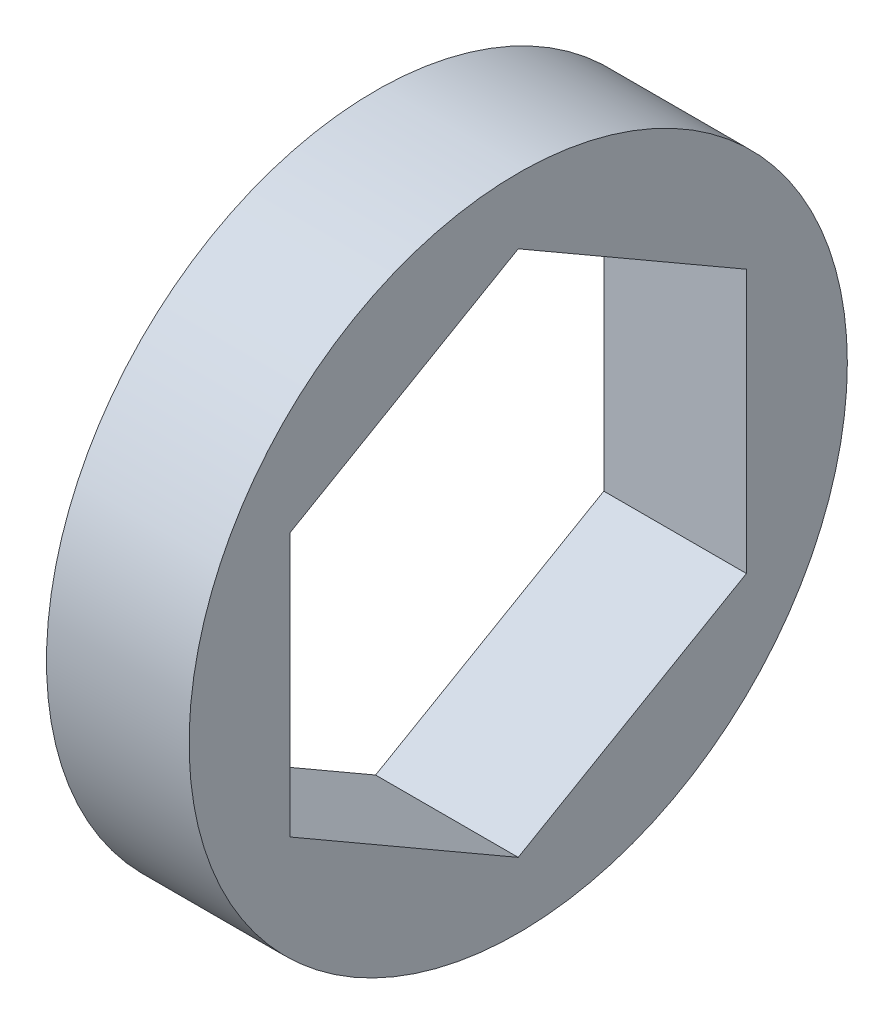
ISO-10303-21;
HEADER;
FILE_DESCRIPTION(('STEP AP214'),'2;1');
FILE_NAME('part.step','',(''),(''),'','','');
FILE_SCHEMA(('AUTOMOTIVE_DESIGN { 1 0 10303 214 1 1 1 1 }'));
ENDSEC;
DATA;
#1=APPLICATION_CONTEXT('core data for automotive mechanical design processes');
#2=APPLICATION_PROTOCOL_DEFINITION('international standard','automotive_design',2000,#1);
#3=PRODUCT_CONTEXT('',#1,'mechanical');
#4=PRODUCT('Part','Part','',(#3));
#5=PRODUCT_RELATED_PRODUCT_CATEGORY('part','',(#4));
#6=PRODUCT_DEFINITION_FORMATION('','',#4);
#7=PRODUCT_DEFINITION_CONTEXT('part definition',#1,'design');
#8=PRODUCT_DEFINITION('design','',#6,#7);
#9=PRODUCT_DEFINITION_SHAPE('','',#8);
#10=(LENGTH_UNIT() NAMED_UNIT(*) SI_UNIT(.MILLI.,.METRE.));
#11=(NAMED_UNIT(*) PLANE_ANGLE_UNIT() SI_UNIT($,.RADIAN.));
#12=(NAMED_UNIT(*) SI_UNIT($,.STERADIAN.) SOLID_ANGLE_UNIT());
#13=UNCERTAINTY_MEASURE_WITH_UNIT(LENGTH_MEASURE(1.E-05),#10,'distance_accuracy_value','');
#14=(GEOMETRIC_REPRESENTATION_CONTEXT(3) GLOBAL_UNCERTAINTY_ASSIGNED_CONTEXT((#13)) GLOBAL_UNIT_ASSIGNED_CONTEXT((#10,
#11,#12)) REPRESENTATION_CONTEXT('',''));
#15=CARTESIAN_POINT('',(0.,0.,0.));
#16=DIRECTION('',(0.,0.,1.));
#17=DIRECTION('',(1.,0.,0.));
#18=AXIS2_PLACEMENT_3D('',#15,#16,#17);
#19=CARTESIAN_POINT('',(4.1275,0.,0.));
#20=DIRECTION('',(1.,0.,0.));
#21=DIRECTION('',(0.,0.,-1.));
#22=AXIS2_PLACEMENT_3D('',#19,#20,#21);
#23=PLANE('',#22);
#24=CARTESIAN_POINT('',(4.1275,0.,0.));
#25=DIRECTION('',(1.,0.,0.));
#26=DIRECTION('',(0.,0.,-1.));
#27=AXIS2_PLACEMENT_3D('',#24,#25,#26);
#28=CIRCLE('',#27,9.525);
#29=CARTESIAN_POINT('',(4.1275,0.,-9.525));
#30=VERTEX_POINT('',#29);
#31=EDGE_CURVE('E11',#30,#30,#28,.T.);
#32=ORIENTED_EDGE('',*,*,#31,.T.);
#33=EDGE_LOOP('',(#32));
#34=FACE_BOUND('',#33,.T.);
#35=DIRECTION('',(0.,-0.5,0.866025403784438));
#36=VECTOR('',#35,1.);
#37=CARTESIAN_POINT('',(4.1275,7.62564235545658,0.));
#38=LINE('',#37,#36);
#39=CARTESIAN_POINT('',(4.1275,7.62564235545658,0.));
#40=VERTEX_POINT('',#39);
#41=CARTESIAN_POINT('',(4.1275,3.81282117772829,6.604));
#42=VERTEX_POINT('',#41);
#43=EDGE_CURVE('E97',#40,#42,#38,.T.);
#44=ORIENTED_EDGE('',*,*,#43,.F.);
#45=DIRECTION('',(0.,0.5,0.866025403784439));
#46=VECTOR('',#45,1.);
#47=CARTESIAN_POINT('',(4.1275,3.81282117772829,-6.604));
#48=LINE('',#47,#46);
#49=CARTESIAN_POINT('',(4.1275,3.81282117772829,-6.604));
#50=VERTEX_POINT('',#49);
#51=EDGE_CURVE('E89',#50,#40,#48,.T.);
#52=ORIENTED_EDGE('',*,*,#51,.F.);
#53=DIRECTION('',(0.,1.,0.));
#54=VECTOR('',#53,1.);
#55=CARTESIAN_POINT('',(4.1275,-3.81282117772829,-6.604));
#56=LINE('',#55,#54);
#57=CARTESIAN_POINT('',(4.1275,-3.81282117772829,-6.604));
#58=VERTEX_POINT('',#57);
#59=EDGE_CURVE('E117',#58,#50,#56,.T.);
#60=ORIENTED_EDGE('',*,*,#59,.F.);
#61=DIRECTION('',(0.,0.5,-0.866025403784439));
#62=VECTOR('',#61,1.);
#63=CARTESIAN_POINT('',(4.1275,-7.62564235545658,0.));
#64=LINE('',#63,#62);
#65=CARTESIAN_POINT('',(4.1275,-7.62564235545658,0.));
#66=VERTEX_POINT('',#65);
#67=EDGE_CURVE('E115',#66,#58,#64,.T.);
#68=ORIENTED_EDGE('',*,*,#67,.F.);
#69=DIRECTION('',(0.,-0.5,-0.866025403784439));
#70=VECTOR('',#69,1.);
#71=CARTESIAN_POINT('',(4.1275,-3.81282117772829,6.604));
#72=LINE('',#71,#70);
#73=CARTESIAN_POINT('',(4.1275,-3.81282117772829,6.604));
#74=VERTEX_POINT('',#73);
#75=EDGE_CURVE('E111',#74,#66,#72,.T.);
#76=ORIENTED_EDGE('',*,*,#75,.F.);
#77=DIRECTION('',(0.,-1.,0.));
#78=VECTOR('',#77,1.);
#79=CARTESIAN_POINT('',(4.1275,3.81282117772829,6.604));
#80=LINE('',#79,#78);
#81=EDGE_CURVE('E109',#42,#74,#80,.T.);
#82=ORIENTED_EDGE('',*,*,#81,.F.);
#83=EDGE_LOOP('',(#44,#52,#60,#68,#76,#82));
#84=FACE_BOUND('',#83,.T.);
#85=ADVANCED_FACE('F36',(#34,#84),#23,.T.);
#86=CARTESIAN_POINT('',(0.,0.,0.));
#87=DIRECTION('',(1.,0.,0.));
#88=DIRECTION('',(0.,0.,-1.));
#89=AXIS2_PLACEMENT_3D('',#86,#87,#88);
#90=PLANE('',#89);
#91=CARTESIAN_POINT('',(0.,0.,0.));
#92=DIRECTION('',(1.,0.,0.));
#93=DIRECTION('',(0.,0.,-1.));
#94=AXIS2_PLACEMENT_3D('',#91,#92,#93);
#95=CIRCLE('',#94,9.525);
#96=CARTESIAN_POINT('',(0.,0.,-9.525));
#97=VERTEX_POINT('',#96);
#98=EDGE_CURVE('E40',#97,#97,#95,.T.);
#99=ORIENTED_EDGE('',*,*,#98,.F.);
#100=EDGE_LOOP('',(#99));
#101=FACE_BOUND('',#100,.T.);
#102=DIRECTION('',(0.,0.5,0.866025403784439));
#103=VECTOR('',#102,1.);
#104=CARTESIAN_POINT('',(0.,3.81282117772829,-6.604));
#105=LINE('',#104,#103);
#106=CARTESIAN_POINT('',(0.,3.81282117772829,-6.604));
#107=VERTEX_POINT('',#106);
#108=CARTESIAN_POINT('',(0.,7.62564235545658,0.));
#109=VERTEX_POINT('',#108);
#110=EDGE_CURVE('E59',#107,#109,#105,.T.);
#111=ORIENTED_EDGE('',*,*,#110,.T.);
#112=DIRECTION('',(0.,-0.5,0.866025403784438));
#113=VECTOR('',#112,1.);
#114=CARTESIAN_POINT('',(0.,7.62564235545658,0.));
#115=LINE('',#114,#113);
#116=CARTESIAN_POINT('',(0.,3.81282117772829,6.604));
#117=VERTEX_POINT('',#116);
#118=EDGE_CURVE('E104',#109,#117,#115,.T.);
#119=ORIENTED_EDGE('',*,*,#118,.T.);
#120=DIRECTION('',(0.,-1.,0.));
#121=VECTOR('',#120,1.);
#122=CARTESIAN_POINT('',(0.,3.81282117772829,6.604));
#123=LINE('',#122,#121);
#124=CARTESIAN_POINT('',(0.,-3.81282117772829,6.604));
#125=VERTEX_POINT('',#124);
#126=EDGE_CURVE('E121',#117,#125,#123,.T.);
#127=ORIENTED_EDGE('',*,*,#126,.T.);
#128=DIRECTION('',(0.,-0.5,-0.866025403784439));
#129=VECTOR('',#128,1.);
#130=CARTESIAN_POINT('',(0.,-3.81282117772829,6.604));
#131=LINE('',#130,#129);
#132=CARTESIAN_POINT('',(0.,-7.62564235545658,0.));
#133=VERTEX_POINT('',#132);
#134=EDGE_CURVE('E124',#125,#133,#131,.T.);
#135=ORIENTED_EDGE('',*,*,#134,.T.);
#136=DIRECTION('',(0.,0.5,-0.866025403784439));
#137=VECTOR('',#136,1.);
#138=CARTESIAN_POINT('',(0.,-7.62564235545658,0.));
#139=LINE('',#138,#137);
#140=CARTESIAN_POINT('',(0.,-3.81282117772829,-6.604));
#141=VERTEX_POINT('',#140);
#142=EDGE_CURVE('E127',#133,#141,#139,.T.);
#143=ORIENTED_EDGE('',*,*,#142,.T.);
#144=DIRECTION('',(0.,1.,0.));
#145=VECTOR('',#144,1.);
#146=CARTESIAN_POINT('',(0.,-3.81282117772829,-6.604));
#147=LINE('',#146,#145);
#148=EDGE_CURVE('E98',#141,#107,#147,.T.);
#149=ORIENTED_EDGE('',*,*,#148,.T.);
#150=EDGE_LOOP('',(#111,#119,#127,#135,#143,#149));
#151=FACE_BOUND('',#150,.T.);
#152=ADVANCED_FACE('F144',(#101,#151),#90,.F.);
#153=CARTESIAN_POINT('',(4.1275,0.,0.));
#154=DIRECTION('',(-1.,0.,0.));
#155=DIRECTION('',(0.,0.,1.));
#156=AXIS2_PLACEMENT_3D('',#153,#154,#155);
#157=CYLINDRICAL_SURFACE('',#156,9.525);
#158=ORIENTED_EDGE('',*,*,#31,.F.);
#159=EDGE_LOOP('',(#158));
#160=FACE_BOUND('',#159,.T.);
#161=ORIENTED_EDGE('',*,*,#98,.T.);
#162=EDGE_LOOP('',(#161));
#163=FACE_BOUND('',#162,.T.);
#164=ADVANCED_FACE('F38',(#160,#163),#157,.T.);
#165=CARTESIAN_POINT('',(4.1275,3.81282117772829,-6.604));
#166=DIRECTION('',(0.,-0.866025403784439,0.5));
#167=DIRECTION('',(0.,-0.5,-0.866025403784439));
#168=AXIS2_PLACEMENT_3D('',#165,#166,#167);
#169=PLANE('',#168);
#170=ORIENTED_EDGE('',*,*,#110,.F.);
#171=DIRECTION('',(-1.,0.,0.));
#172=VECTOR('',#171,1.);
#173=CARTESIAN_POINT('',(4.1275,3.81282117772829,-6.604));
#174=LINE('',#173,#172);
#175=EDGE_CURVE('E93',#50,#107,#174,.T.);
#176=ORIENTED_EDGE('',*,*,#175,.F.);
#177=ORIENTED_EDGE('',*,*,#51,.T.);
#178=DIRECTION('',(-1.,0.,0.));
#179=VECTOR('',#178,1.);
#180=CARTESIAN_POINT('',(4.1275,7.62564235545658,0.));
#181=LINE('',#180,#179);
#182=EDGE_CURVE('E92',#40,#109,#181,.T.);
#183=ORIENTED_EDGE('',*,*,#182,.T.);
#184=EDGE_LOOP('',(#170,#176,#177,#183));
#185=FACE_BOUND('',#184,.T.);
#186=ADVANCED_FACE('F91',(#185),#169,.T.);
#187=CARTESIAN_POINT('',(4.1275,7.62564235545658,0.));
#188=DIRECTION('',(0.,-0.866025403784438,-0.5));
#189=DIRECTION('',(0.,0.5,-0.866025403784439));
#190=AXIS2_PLACEMENT_3D('',#187,#188,#189);
#191=PLANE('',#190);
#192=ORIENTED_EDGE('',*,*,#118,.F.);
#193=ORIENTED_EDGE('',*,*,#182,.F.);
#194=ORIENTED_EDGE('',*,*,#43,.T.);
#195=DIRECTION('',(-1.,0.,0.));
#196=VECTOR('',#195,1.);
#197=CARTESIAN_POINT('',(4.1275,3.81282117772829,6.604));
#198=LINE('',#197,#196);
#199=EDGE_CURVE('E105',#42,#117,#198,.T.);
#200=ORIENTED_EDGE('',*,*,#199,.T.);
#201=EDGE_LOOP('',(#192,#193,#194,#200));
#202=FACE_BOUND('',#201,.T.);
#203=ADVANCED_FACE('F101',(#202),#191,.T.);
#204=CARTESIAN_POINT('',(4.1275,3.81282117772829,6.604));
#205=DIRECTION('',(0.,0.,-1.));
#206=DIRECTION('',(0.,1.,0.));
#207=AXIS2_PLACEMENT_3D('',#204,#205,#206);
#208=PLANE('',#207);
#209=ORIENTED_EDGE('',*,*,#126,.F.);
#210=ORIENTED_EDGE('',*,*,#199,.F.);
#211=ORIENTED_EDGE('',*,*,#81,.T.);
#212=DIRECTION('',(-1.,0.,0.));
#213=VECTOR('',#212,1.);
#214=CARTESIAN_POINT('',(4.1275,-3.81282117772829,6.604));
#215=LINE('',#214,#213);
#216=EDGE_CURVE('E136',#74,#125,#215,.T.);
#217=ORIENTED_EDGE('',*,*,#216,.T.);
#218=EDGE_LOOP('',(#209,#210,#211,#217));
#219=FACE_BOUND('',#218,.T.);
#220=ADVANCED_FACE('F140',(#219),#208,.T.);
#221=CARTESIAN_POINT('',(4.1275,-3.81282117772829,6.604));
#222=DIRECTION('',(0.,0.866025403784439,-0.5));
#223=DIRECTION('',(0.,0.5,0.866025403784439));
#224=AXIS2_PLACEMENT_3D('',#221,#222,#223);
#225=PLANE('',#224);
#226=ORIENTED_EDGE('',*,*,#134,.F.);
#227=ORIENTED_EDGE('',*,*,#216,.F.);
#228=ORIENTED_EDGE('',*,*,#75,.T.);
#229=DIRECTION('',(-1.,0.,0.));
#230=VECTOR('',#229,1.);
#231=CARTESIAN_POINT('',(4.1275,-7.62564235545658,0.));
#232=LINE('',#231,#230);
#233=EDGE_CURVE('E134',#66,#133,#232,.T.);
#234=ORIENTED_EDGE('',*,*,#233,.T.);
#235=EDGE_LOOP('',(#226,#227,#228,#234));
#236=FACE_BOUND('',#235,.T.);
#237=ADVANCED_FACE('F152',(#236),#225,.T.);
#238=CARTESIAN_POINT('',(4.1275,-7.62564235545658,0.));
#239=DIRECTION('',(0.,0.866025403784439,0.5));
#240=DIRECTION('',(0.,-0.5,0.866025403784439));
#241=AXIS2_PLACEMENT_3D('',#238,#239,#240);
#242=PLANE('',#241);
#243=ORIENTED_EDGE('',*,*,#142,.F.);
#244=ORIENTED_EDGE('',*,*,#233,.F.);
#245=ORIENTED_EDGE('',*,*,#67,.T.);
#246=DIRECTION('',(-1.,0.,0.));
#247=VECTOR('',#246,1.);
#248=CARTESIAN_POINT('',(4.1275,-3.81282117772829,-6.604));
#249=LINE('',#248,#247);
#250=EDGE_CURVE('E51',#58,#141,#249,.T.);
#251=ORIENTED_EDGE('',*,*,#250,.T.);
#252=EDGE_LOOP('',(#243,#244,#245,#251));
#253=FACE_BOUND('',#252,.T.);
#254=ADVANCED_FACE('F150',(#253),#242,.T.);
#255=CARTESIAN_POINT('',(4.1275,-3.81282117772829,-6.604));
#256=DIRECTION('',(0.,0.,1.));
#257=DIRECTION('',(0.,-1.,0.));
#258=AXIS2_PLACEMENT_3D('',#255,#256,#257);
#259=PLANE('',#258);
#260=ORIENTED_EDGE('',*,*,#148,.F.);
#261=ORIENTED_EDGE('',*,*,#250,.F.);
#262=ORIENTED_EDGE('',*,*,#59,.T.);
#263=ORIENTED_EDGE('',*,*,#175,.T.);
#264=EDGE_LOOP('',(#260,#261,#262,#263));
#265=FACE_BOUND('',#264,.T.);
#266=ADVANCED_FACE('F146',(#265),#259,.T.);
#267=CLOSED_SHELL('',(#85,#152,#164,#186,#203,#220,#237,#254,#266));
#268=MANIFOLD_SOLID_BREP('B2',#267);
#269=ADVANCED_BREP_SHAPE_REPRESENTATION('',(#18,#268),#14);
#270=SHAPE_DEFINITION_REPRESENTATION(#9,#269);
ENDSEC;
END-ISO-10303-21;
